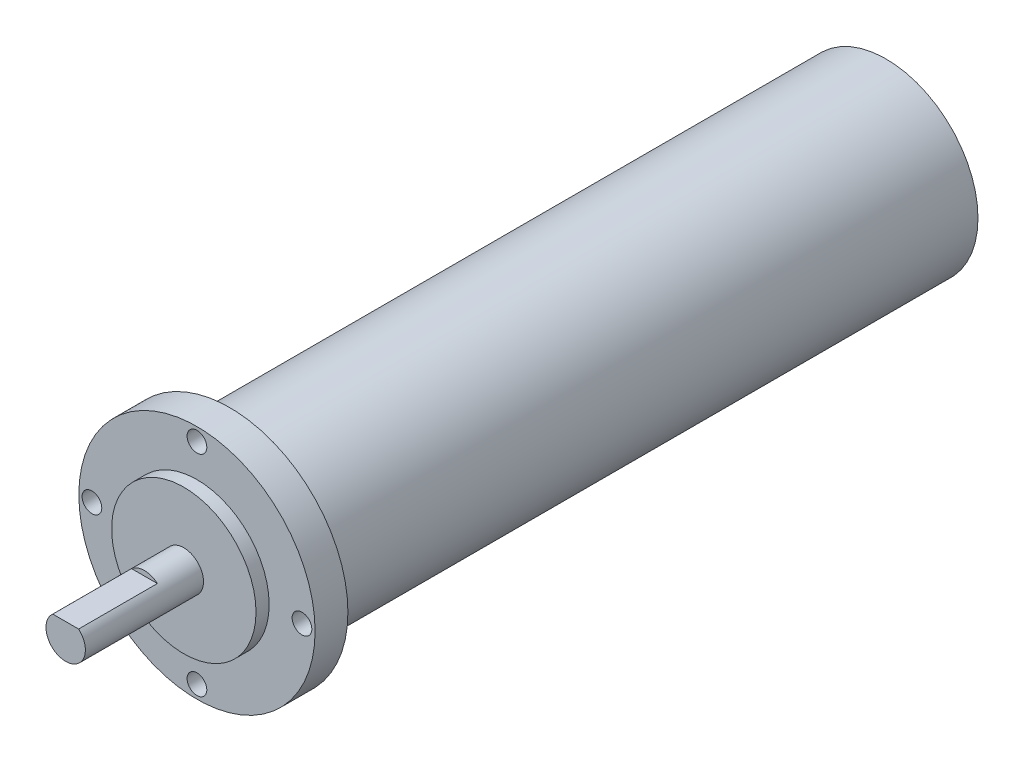
ISO-10303-21;
HEADER;
FILE_DESCRIPTION(('STEP AP214'),'2;1');
FILE_NAME('part.step','',(''),(''),'','','');
FILE_SCHEMA(('AUTOMOTIVE_DESIGN { 1 0 10303 214 1 1 1 1 }'));
ENDSEC;
DATA;
#1=APPLICATION_CONTEXT('core data for automotive mechanical design processes');
#2=APPLICATION_PROTOCOL_DEFINITION('international standard','automotive_design',2000,#1);
#3=PRODUCT_CONTEXT('',#1,'mechanical');
#4=PRODUCT('Part','Part','',(#3));
#5=PRODUCT_RELATED_PRODUCT_CATEGORY('part','',(#4));
#6=PRODUCT_DEFINITION_FORMATION('','',#4);
#7=PRODUCT_DEFINITION_CONTEXT('part definition',#1,'design');
#8=PRODUCT_DEFINITION('design','',#6,#7);
#9=PRODUCT_DEFINITION_SHAPE('','',#8);
#10=(LENGTH_UNIT() NAMED_UNIT(*) SI_UNIT(.MILLI.,.METRE.));
#11=(NAMED_UNIT(*) PLANE_ANGLE_UNIT() SI_UNIT($,.RADIAN.));
#12=(NAMED_UNIT(*) SI_UNIT($,.STERADIAN.) SOLID_ANGLE_UNIT());
#13=UNCERTAINTY_MEASURE_WITH_UNIT(LENGTH_MEASURE(1.E-05),#10,'distance_accuracy_value','');
#14=(GEOMETRIC_REPRESENTATION_CONTEXT(3) GLOBAL_UNCERTAINTY_ASSIGNED_CONTEXT((#13)) GLOBAL_UNIT_ASSIGNED_CONTEXT((#10,
#11,#12)) REPRESENTATION_CONTEXT('',''));
#15=CARTESIAN_POINT('',(0.,0.,0.));
#16=DIRECTION('',(0.,0.,1.));
#17=DIRECTION('',(1.,0.,0.));
#18=AXIS2_PLACEMENT_3D('',#15,#16,#17);
#19=CARTESIAN_POINT('',(0.,0.,113.));
#20=DIRECTION('',(0.,0.,1.));
#21=DIRECTION('',(1.,0.,0.));
#22=AXIS2_PLACEMENT_3D('',#19,#20,#21);
#23=PLANE('',#22);
#24=CARTESIAN_POINT('',(0.,0.,113.));
#25=DIRECTION('',(0.,0.,1.));
#26=DIRECTION('',(1.,0.,0.));
#27=AXIS2_PLACEMENT_3D('',#24,#25,#26);
#28=CIRCLE('',#27,3.);
#29=CARTESIAN_POINT('',(1.96985389912706,2.26267001926793,113.));
#30=VERTEX_POINT('',#29);
#31=CARTESIAN_POINT('',(-1.96985389912706,2.26267001926793,113.));
#32=VERTEX_POINT('',#31);
#33=EDGE_CURVE('E79',#30,#32,#28,.T.);
#34=ORIENTED_EDGE('',*,*,#33,.T.);
#35=DIRECTION('',(1.,0.,0.));
#36=VECTOR('',#35,1.);
#37=CARTESIAN_POINT('',(0.,2.26267001926793,113.));
#38=LINE('',#37,#36);
#39=EDGE_CURVE('E12',#32,#30,#38,.T.);
#40=ORIENTED_EDGE('',*,*,#39,.T.);
#41=EDGE_LOOP('',(#34,#40));
#42=FACE_BOUND('',#41,.T.);
#43=ADVANCED_FACE('F45',(#42),#23,.T.);
#44=CARTESIAN_POINT('',(0.,0.,107.));
#45=DIRECTION('',(0.,0.,-1.));
#46=DIRECTION('',(-1.,0.,0.));
#47=AXIS2_PLACEMENT_3D('',#44,#45,#46);
#48=CYLINDRICAL_SURFACE('',#47,11.);
#49=CARTESIAN_POINT('',(0.,0.,107.));
#50=DIRECTION('',(0.,0.,1.));
#51=DIRECTION('',(1.,0.,0.));
#52=AXIS2_PLACEMENT_3D('',#49,#50,#51);
#53=CIRCLE('',#52,11.);
#54=CARTESIAN_POINT('',(11.,0.,107.));
#55=VERTEX_POINT('',#54);
#56=EDGE_CURVE('E90',#55,#55,#53,.T.);
#57=ORIENTED_EDGE('',*,*,#56,.F.);
#58=EDGE_LOOP('',(#57));
#59=FACE_BOUND('',#58,.T.);
#60=CARTESIAN_POINT('',(0.,0.,105.));
#61=DIRECTION('',(0.,0.,1.));
#62=DIRECTION('',(1.,0.,0.));
#63=AXIS2_PLACEMENT_3D('',#60,#61,#62);
#64=CIRCLE('',#63,11.);
#65=CARTESIAN_POINT('',(11.,0.,105.));
#66=VERTEX_POINT('',#65);
#67=EDGE_CURVE('E87',#66,#66,#64,.T.);
#68=ORIENTED_EDGE('',*,*,#67,.T.);
#69=EDGE_LOOP('',(#68));
#70=FACE_BOUND('',#69,.T.);
#71=ADVANCED_FACE('F47',(#59,#70),#48,.T.);
#72=CARTESIAN_POINT('',(0.,0.,107.));
#73=DIRECTION('',(0.,0.,1.));
#74=DIRECTION('',(1.,0.,0.));
#75=AXIS2_PLACEMENT_3D('',#72,#73,#74);
#76=PLANE('',#75);
#77=CARTESIAN_POINT('',(0.,0.,107.));
#78=DIRECTION('',(0.,0.,1.));
#79=DIRECTION('',(1.,0.,0.));
#80=AXIS2_PLACEMENT_3D('',#77,#78,#79);
#81=CIRCLE('',#80,3.);
#82=CARTESIAN_POINT('',(3.,0.,107.));
#83=VERTEX_POINT('',#82);
#84=EDGE_CURVE('E53',#83,#83,#81,.T.);
#85=ORIENTED_EDGE('',*,*,#84,.F.);
#86=EDGE_LOOP('',(#85));
#87=FACE_BOUND('',#86,.T.);
#88=ORIENTED_EDGE('',*,*,#56,.T.);
#89=EDGE_LOOP('',(#88));
#90=FACE_BOUND('',#89,.T.);
#91=ADVANCED_FACE('F98',(#87,#90),#76,.T.);
#92=CARTESIAN_POINT('',(0.,0.,105.));
#93=DIRECTION('',(0.,0.,1.));
#94=DIRECTION('',(1.,0.,0.));
#95=AXIS2_PLACEMENT_3D('',#92,#93,#94);
#96=PLANE('',#95);
#97=ORIENTED_EDGE('',*,*,#67,.F.);
#98=EDGE_LOOP('',(#97));
#99=FACE_BOUND('',#98,.T.);
#100=ADVANCED_FACE('F96',(#99),#96,.F.);
#101=CARTESIAN_POINT('',(0.,0.,113.));
#102=DIRECTION('',(0.,0.,-1.));
#103=DIRECTION('',(-1.,0.,0.));
#104=AXIS2_PLACEMENT_3D('',#101,#102,#103);
#105=CYLINDRICAL_SURFACE('',#104,3.);
#106=ORIENTED_EDGE('',*,*,#84,.T.);
#107=EDGE_LOOP('',(#106));
#108=FACE_BOUND('',#107,.T.);
#109=DIRECTION('',(0.,0.,-1.));
#110=VECTOR('',#109,1.);
#111=CARTESIAN_POINT('',(-1.96985389912706,2.26267001926793,125.));
#112=LINE('',#111,#110);
#113=CARTESIAN_POINT('',(-1.96985389912706,2.26267001926793,125.));
#114=VERTEX_POINT('',#113);
#115=EDGE_CURVE('E80',#114,#32,#112,.T.);
#116=ORIENTED_EDGE('',*,*,#115,.T.);
#117=ORIENTED_EDGE('',*,*,#33,.F.);
#118=DIRECTION('',(0.,0.,-1.));
#119=VECTOR('',#118,1.);
#120=CARTESIAN_POINT('',(1.96985389912705,2.26267001926793,125.));
#121=LINE('',#120,#119);
#122=CARTESIAN_POINT('',(1.96985389912705,2.26267001926793,125.));
#123=VERTEX_POINT('',#122);
#124=EDGE_CURVE('E60',#123,#30,#121,.T.);
#125=ORIENTED_EDGE('',*,*,#124,.F.);
#126=CARTESIAN_POINT('',(0.,0.,125.));
#127=DIRECTION('',(0.,0.,1.));
#128=DIRECTION('',(-1.,0.,0.));
#129=AXIS2_PLACEMENT_3D('',#126,#127,#128);
#130=CIRCLE('',#129,3.);
#131=EDGE_CURVE('E71',#114,#123,#130,.T.);
#132=ORIENTED_EDGE('',*,*,#131,.F.);
#133=EDGE_LOOP('',(#116,#117,#125,#132));
#134=FACE_BOUND('',#133,.T.);
#135=ADVANCED_FACE('F77',(#108,#134),#105,.T.);
#136=CARTESIAN_POINT('',(-1.96985389912706,2.26267001926793,125.));
#137=DIRECTION('',(0.,-1.,0.));
#138=DIRECTION('',(0.,0.,-1.));
#139=AXIS2_PLACEMENT_3D('',#136,#137,#138);
#140=PLANE('',#139);
#141=ORIENTED_EDGE('',*,*,#39,.F.);
#142=ORIENTED_EDGE('',*,*,#115,.F.);
#143=DIRECTION('',(-1.,0.,0.));
#144=VECTOR('',#143,1.);
#145=CARTESIAN_POINT('',(-1.96985389912706,2.26267001926793,125.));
#146=LINE('',#145,#144);
#147=EDGE_CURVE('E73',#123,#114,#146,.T.);
#148=ORIENTED_EDGE('',*,*,#147,.F.);
#149=ORIENTED_EDGE('',*,*,#124,.T.);
#150=EDGE_LOOP('',(#141,#142,#148,#149));
#151=FACE_BOUND('',#150,.T.);
#152=ADVANCED_FACE('F82',(#151),#140,.F.);
#153=CARTESIAN_POINT('',(0.,0.,125.));
#154=DIRECTION('',(0.,0.,-1.));
#155=DIRECTION('',(-1.,0.,0.));
#156=AXIS2_PLACEMENT_3D('',#153,#154,#155);
#157=PLANE('',#156);
#158=ORIENTED_EDGE('',*,*,#131,.T.);
#159=ORIENTED_EDGE('',*,*,#147,.T.);
#160=EDGE_LOOP('',(#158,#159));
#161=FACE_BOUND('',#160,.T.);
#162=ADVANCED_FACE('F72',(#161),#157,.F.);
#163=CLOSED_SHELL('',(#43,#71,#91,#100,#135,#152,#162));
#164=MANIFOLD_SOLID_BREP('B2',#163);
#165=CARTESIAN_POINT('',(0.,0.,100.));
#166=DIRECTION('',(0.,0.,-1.));
#167=DIRECTION('',(-1.,0.,0.));
#168=AXIS2_PLACEMENT_3D('',#165,#166,#167);
#169=CYLINDRICAL_SURFACE('',#168,14.);
#170=CARTESIAN_POINT('',(0.,0.,100.));
#171=DIRECTION('',(0.,0.,1.));
#172=DIRECTION('',(1.,0.,0.));
#173=AXIS2_PLACEMENT_3D('',#170,#171,#172);
#174=CIRCLE('',#173,14.);
#175=CARTESIAN_POINT('',(14.,0.,100.));
#176=VERTEX_POINT('',#175);
#177=EDGE_CURVE('E44',#176,#176,#174,.T.);
#178=ORIENTED_EDGE('',*,*,#177,.F.);
#179=EDGE_LOOP('',(#178));
#180=FACE_BOUND('',#179,.T.);
#181=CARTESIAN_POINT('',(0.,0.,0.));
#182=DIRECTION('',(0.,0.,1.));
#183=DIRECTION('',(1.,0.,0.));
#184=AXIS2_PLACEMENT_3D('',#181,#182,#183);
#185=CIRCLE('',#184,14.);
#186=CARTESIAN_POINT('',(14.,0.,0.));
#187=VERTEX_POINT('',#186);
#188=EDGE_CURVE('E174',#187,#187,#185,.T.);
#189=ORIENTED_EDGE('',*,*,#188,.T.);
#190=EDGE_LOOP('',(#189));
#191=FACE_BOUND('',#190,.T.);
#192=ADVANCED_FACE('F171',(#180,#191),#169,.T.);
#193=CARTESIAN_POINT('',(0.,0.,0.));
#194=DIRECTION('',(0.,0.,1.));
#195=DIRECTION('',(1.,0.,0.));
#196=AXIS2_PLACEMENT_3D('',#193,#194,#195);
#197=PLANE('',#196);
#198=ORIENTED_EDGE('',*,*,#188,.F.);
#199=EDGE_LOOP('',(#198));
#200=FACE_BOUND('',#199,.T.);
#201=ADVANCED_FACE('F219',(#200),#197,.F.);
#202=CARTESIAN_POINT('',(0.,0.,105.));
#203=DIRECTION('',(0.,0.,1.));
#204=DIRECTION('',(1.,0.,0.));
#205=AXIS2_PLACEMENT_3D('',#202,#203,#204);
#206=PLANE('',#205);
#207=CARTESIAN_POINT('',(-16.,0.,105.));
#208=DIRECTION('',(0.,0.,1.));
#209=DIRECTION('',(1.,0.,0.));
#210=AXIS2_PLACEMENT_3D('',#207,#208,#209);
#211=CIRCLE('',#210,1.5);
#212=CARTESIAN_POINT('',(-14.5,0.,105.));
#213=VERTEX_POINT('',#212);
#214=EDGE_CURVE('E198',#213,#213,#211,.T.);
#215=ORIENTED_EDGE('',*,*,#214,.F.);
#216=EDGE_LOOP('',(#215));
#217=FACE_BOUND('',#216,.T.);
#218=CARTESIAN_POINT('',(16.,0.,105.));
#219=DIRECTION('',(0.,0.,1.));
#220=DIRECTION('',(1.,0.,0.));
#221=AXIS2_PLACEMENT_3D('',#218,#219,#220);
#222=CIRCLE('',#221,1.5);
#223=CARTESIAN_POINT('',(17.5,0.,105.));
#224=VERTEX_POINT('',#223);
#225=EDGE_CURVE('E186',#224,#224,#222,.T.);
#226=ORIENTED_EDGE('',*,*,#225,.F.);
#227=EDGE_LOOP('',(#226));
#228=FACE_BOUND('',#227,.T.);
#229=CARTESIAN_POINT('',(0.,0.,105.));
#230=DIRECTION('',(0.,0.,1.));
#231=DIRECTION('',(1.,0.,0.));
#232=AXIS2_PLACEMENT_3D('',#229,#230,#231);
#233=CIRCLE('',#232,18.);
#234=CARTESIAN_POINT('',(18.,0.,105.));
#235=VERTEX_POINT('',#234);
#236=EDGE_CURVE('E181',#235,#235,#233,.T.);
#237=ORIENTED_EDGE('',*,*,#236,.T.);
#238=EDGE_LOOP('',(#237));
#239=FACE_BOUND('',#238,.T.);
#240=CARTESIAN_POINT('',(0.,16.,105.));
#241=DIRECTION('',(0.,0.,1.));
#242=DIRECTION('',(1.,0.,0.));
#243=AXIS2_PLACEMENT_3D('',#240,#241,#242);
#244=CIRCLE('',#243,1.5);
#245=CARTESIAN_POINT('',(1.5,16.,105.));
#246=VERTEX_POINT('',#245);
#247=EDGE_CURVE('E192',#246,#246,#244,.T.);
#248=ORIENTED_EDGE('',*,*,#247,.F.);
#249=EDGE_LOOP('',(#248));
#250=FACE_BOUND('',#249,.T.);
#251=CARTESIAN_POINT('',(0.,-16.,105.));
#252=DIRECTION('',(0.,0.,1.));
#253=DIRECTION('',(1.,0.,0.));
#254=AXIS2_PLACEMENT_3D('',#251,#252,#253);
#255=CIRCLE('',#254,1.5);
#256=CARTESIAN_POINT('',(1.5,-16.,105.));
#257=VERTEX_POINT('',#256);
#258=EDGE_CURVE('E204',#257,#257,#255,.T.);
#259=ORIENTED_EDGE('',*,*,#258,.F.);
#260=EDGE_LOOP('',(#259));
#261=FACE_BOUND('',#260,.T.);
#262=ADVANCED_FACE('F216',(#217,#228,#239,#250,#261),#206,.T.);
#263=CARTESIAN_POINT('',(0.,0.,100.));
#264=DIRECTION('',(0.,0.,1.));
#265=DIRECTION('',(1.,0.,0.));
#266=AXIS2_PLACEMENT_3D('',#263,#264,#265);
#267=PLANE('',#266);
#268=ORIENTED_EDGE('',*,*,#177,.T.);
#269=EDGE_LOOP('',(#268));
#270=FACE_BOUND('',#269,.T.);
#271=CARTESIAN_POINT('',(0.,0.,100.));
#272=DIRECTION('',(0.,0.,1.));
#273=DIRECTION('',(1.,0.,0.));
#274=AXIS2_PLACEMENT_3D('',#271,#272,#273);
#275=CIRCLE('',#274,18.);
#276=CARTESIAN_POINT('',(18.,0.,100.));
#277=VERTEX_POINT('',#276);
#278=EDGE_CURVE('E183',#277,#277,#275,.T.);
#279=ORIENTED_EDGE('',*,*,#278,.F.);
#280=EDGE_LOOP('',(#279));
#281=FACE_BOUND('',#280,.T.);
#282=CARTESIAN_POINT('',(16.,0.,100.));
#283=DIRECTION('',(0.,0.,1.));
#284=DIRECTION('',(1.,0.,0.));
#285=AXIS2_PLACEMENT_3D('',#282,#283,#284);
#286=CIRCLE('',#285,1.5);
#287=CARTESIAN_POINT('',(17.5,0.,100.));
#288=VERTEX_POINT('',#287);
#289=EDGE_CURVE('E189',#288,#288,#286,.T.);
#290=ORIENTED_EDGE('',*,*,#289,.T.);
#291=EDGE_LOOP('',(#290));
#292=FACE_BOUND('',#291,.T.);
#293=CARTESIAN_POINT('',(0.,16.,100.));
#294=DIRECTION('',(0.,0.,1.));
#295=DIRECTION('',(1.,0.,0.));
#296=AXIS2_PLACEMENT_3D('',#293,#294,#295);
#297=CIRCLE('',#296,1.5);
#298=CARTESIAN_POINT('',(1.5,16.,100.));
#299=VERTEX_POINT('',#298);
#300=EDGE_CURVE('E195',#299,#299,#297,.T.);
#301=ORIENTED_EDGE('',*,*,#300,.T.);
#302=EDGE_LOOP('',(#301));
#303=FACE_BOUND('',#302,.T.);
#304=CARTESIAN_POINT('',(-16.,0.,100.));
#305=DIRECTION('',(0.,0.,1.));
#306=DIRECTION('',(1.,0.,0.));
#307=AXIS2_PLACEMENT_3D('',#304,#305,#306);
#308=CIRCLE('',#307,1.5);
#309=CARTESIAN_POINT('',(-14.5,0.,100.));
#310=VERTEX_POINT('',#309);
#311=EDGE_CURVE('E201',#310,#310,#308,.T.);
#312=ORIENTED_EDGE('',*,*,#311,.T.);
#313=EDGE_LOOP('',(#312));
#314=FACE_BOUND('',#313,.T.);
#315=CARTESIAN_POINT('',(0.,-16.,100.));
#316=DIRECTION('',(0.,0.,1.));
#317=DIRECTION('',(1.,0.,0.));
#318=AXIS2_PLACEMENT_3D('',#315,#316,#317);
#319=CIRCLE('',#318,1.5);
#320=CARTESIAN_POINT('',(1.5,-16.,100.));
#321=VERTEX_POINT('',#320);
#322=EDGE_CURVE('E207',#321,#321,#319,.T.);
#323=ORIENTED_EDGE('',*,*,#322,.T.);
#324=EDGE_LOOP('',(#323));
#325=FACE_BOUND('',#324,.T.);
#326=ADVANCED_FACE('F218',(#270,#281,#292,#303,#314,#325),#267,.F.);
#327=CARTESIAN_POINT('',(0.,0.,105.));
#328=DIRECTION('',(0.,0.,-1.));
#329=DIRECTION('',(-1.,0.,0.));
#330=AXIS2_PLACEMENT_3D('',#327,#328,#329);
#331=CYLINDRICAL_SURFACE('',#330,18.);
#332=ORIENTED_EDGE('',*,*,#236,.F.);
#333=EDGE_LOOP('',(#332));
#334=FACE_BOUND('',#333,.T.);
#335=ORIENTED_EDGE('',*,*,#278,.T.);
#336=EDGE_LOOP('',(#335));
#337=FACE_BOUND('',#336,.T.);
#338=ADVANCED_FACE('F226',(#334,#337),#331,.T.);
#339=CARTESIAN_POINT('',(16.,0.,105.));
#340=DIRECTION('',(0.,0.,-1.));
#341=DIRECTION('',(-1.,0.,0.));
#342=AXIS2_PLACEMENT_3D('',#339,#340,#341);
#343=CYLINDRICAL_SURFACE('',#342,1.5);
#344=ORIENTED_EDGE('',*,*,#225,.T.);
#345=EDGE_LOOP('',(#344));
#346=FACE_BOUND('',#345,.T.);
#347=ORIENTED_EDGE('',*,*,#289,.F.);
#348=EDGE_LOOP('',(#347));
#349=FACE_BOUND('',#348,.T.);
#350=ADVANCED_FACE('F261',(#346,#349),#343,.F.);
#351=CARTESIAN_POINT('',(0.,16.,105.));
#352=DIRECTION('',(0.,0.,-1.));
#353=DIRECTION('',(-1.,0.,0.));
#354=AXIS2_PLACEMENT_3D('',#351,#352,#353);
#355=CYLINDRICAL_SURFACE('',#354,1.5);
#356=ORIENTED_EDGE('',*,*,#247,.T.);
#357=EDGE_LOOP('',(#356));
#358=FACE_BOUND('',#357,.T.);
#359=ORIENTED_EDGE('',*,*,#300,.F.);
#360=EDGE_LOOP('',(#359));
#361=FACE_BOUND('',#360,.T.);
#362=ADVANCED_FACE('F271',(#358,#361),#355,.F.);
#363=CARTESIAN_POINT('',(-16.,0.,105.));
#364=DIRECTION('',(0.,0.,-1.));
#365=DIRECTION('',(-1.,0.,0.));
#366=AXIS2_PLACEMENT_3D('',#363,#364,#365);
#367=CYLINDRICAL_SURFACE('',#366,1.5);
#368=ORIENTED_EDGE('',*,*,#214,.T.);
#369=EDGE_LOOP('',(#368));
#370=FACE_BOUND('',#369,.T.);
#371=ORIENTED_EDGE('',*,*,#311,.F.);
#372=EDGE_LOOP('',(#371));
#373=FACE_BOUND('',#372,.T.);
#374=ADVANCED_FACE('F280',(#370,#373),#367,.F.);
#375=CARTESIAN_POINT('',(0.,-16.,105.));
#376=DIRECTION('',(0.,0.,-1.));
#377=DIRECTION('',(-1.,0.,0.));
#378=AXIS2_PLACEMENT_3D('',#375,#376,#377);
#379=CYLINDRICAL_SURFACE('',#378,1.5);
#380=ORIENTED_EDGE('',*,*,#258,.T.);
#381=EDGE_LOOP('',(#380));
#382=FACE_BOUND('',#381,.T.);
#383=ORIENTED_EDGE('',*,*,#322,.F.);
#384=EDGE_LOOP('',(#383));
#385=FACE_BOUND('',#384,.T.);
#386=ADVANCED_FACE('F213',(#382,#385),#379,.F.);
#387=CLOSED_SHELL('',(#192,#201,#262,#326,#338,#350,#362,#374,#386));
#388=MANIFOLD_SOLID_BREP('B6',#387);
#389=ADVANCED_BREP_SHAPE_REPRESENTATION('',(#18,#164,#388),#14);
#390=SHAPE_DEFINITION_REPRESENTATION(#9,#389);
ENDSEC;
END-ISO-10303-21;
